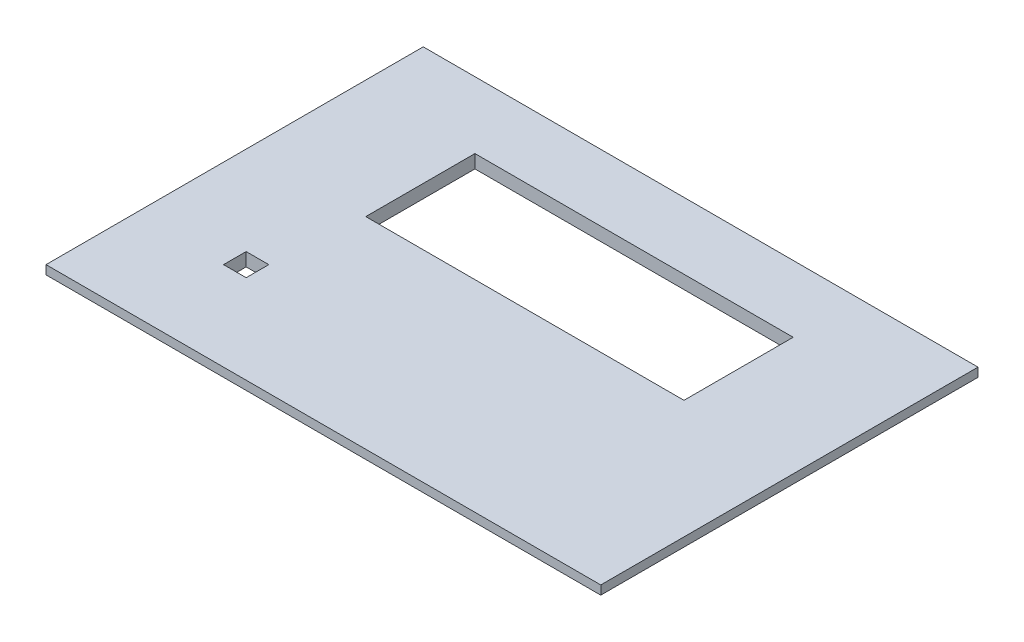
ISO-10303-21;
HEADER;
FILE_DESCRIPTION(('STEP AP214'),'2;1');
FILE_NAME('part.step','',(''),(''),'','','');
FILE_SCHEMA(('AUTOMOTIVE_DESIGN { 1 0 10303 214 1 1 1 1 }'));
ENDSEC;
DATA;
#1=APPLICATION_CONTEXT('core data for automotive mechanical design processes');
#2=APPLICATION_PROTOCOL_DEFINITION('international standard','automotive_design',2000,#1);
#3=PRODUCT_CONTEXT('',#1,'mechanical');
#4=PRODUCT('Part','Part','',(#3));
#5=PRODUCT_RELATED_PRODUCT_CATEGORY('part','',(#4));
#6=PRODUCT_DEFINITION_FORMATION('','',#4);
#7=PRODUCT_DEFINITION_CONTEXT('part definition',#1,'design');
#8=PRODUCT_DEFINITION('design','',#6,#7);
#9=PRODUCT_DEFINITION_SHAPE('','',#8);
#10=(LENGTH_UNIT() NAMED_UNIT(*) SI_UNIT(.MILLI.,.METRE.));
#11=(NAMED_UNIT(*) PLANE_ANGLE_UNIT() SI_UNIT($,.RADIAN.));
#12=(NAMED_UNIT(*) SI_UNIT($,.STERADIAN.) SOLID_ANGLE_UNIT());
#13=UNCERTAINTY_MEASURE_WITH_UNIT(LENGTH_MEASURE(1.E-05),#10,'distance_accuracy_value','');
#14=(GEOMETRIC_REPRESENTATION_CONTEXT(3) GLOBAL_UNCERTAINTY_ASSIGNED_CONTEXT((#13)) GLOBAL_UNIT_ASSIGNED_CONTEXT((#10,
#11,#12)) REPRESENTATION_CONTEXT('',''));
#15=CARTESIAN_POINT('',(0.,0.,0.));
#16=DIRECTION('',(0.,0.,1.));
#17=DIRECTION('',(1.,0.,0.));
#18=AXIS2_PLACEMENT_3D('',#15,#16,#17);
#19=CARTESIAN_POINT('',(57.95,1.,37.95));
#20=DIRECTION('',(-1.,0.,0.));
#21=DIRECTION('',(0.,0.,1.));
#22=AXIS2_PLACEMENT_3D('',#19,#20,#21);
#23=PLANE('',#22);
#24=DIRECTION('',(0.,0.,-1.));
#25=VECTOR('',#24,1.);
#26=CARTESIAN_POINT('',(57.95,0.,37.95));
#27=LINE('',#26,#25);
#28=CARTESIAN_POINT('',(57.95,0.,37.95));
#29=VERTEX_POINT('',#28);
#30=CARTESIAN_POINT('',(57.95,0.,-37.95));
#31=VERTEX_POINT('',#30);
#32=EDGE_CURVE('E251',#29,#31,#27,.T.);
#33=ORIENTED_EDGE('',*,*,#32,.T.);
#34=DIRECTION('',(0.,-1.,0.));
#35=VECTOR('',#34,1.);
#36=CARTESIAN_POINT('',(57.95,1.,-37.95));
#37=LINE('',#36,#35);
#38=CARTESIAN_POINT('',(57.95,1.,-37.95));
#39=VERTEX_POINT('',#38);
#40=EDGE_CURVE('E11',#39,#31,#37,.T.);
#41=ORIENTED_EDGE('',*,*,#40,.F.);
#42=DIRECTION('',(0.,0.,-1.));
#43=VECTOR('',#42,1.);
#44=CARTESIAN_POINT('',(57.95,1.,37.95));
#45=LINE('',#44,#43);
#46=CARTESIAN_POINT('',(57.95,1.,37.95));
#47=VERTEX_POINT('',#46);
#48=EDGE_CURVE('E252',#47,#39,#45,.T.);
#49=ORIENTED_EDGE('',*,*,#48,.F.);
#50=DIRECTION('',(0.,-1.,0.));
#51=VECTOR('',#50,1.);
#52=CARTESIAN_POINT('',(57.95,1.,37.95));
#53=LINE('',#52,#51);
#54=EDGE_CURVE('E265',#47,#29,#53,.T.);
#55=ORIENTED_EDGE('',*,*,#54,.T.);
#56=EDGE_LOOP('',(#33,#41,#49,#55));
#57=FACE_BOUND('',#56,.T.);
#58=ADVANCED_FACE('F39',(#57),#23,.F.);
#59=CARTESIAN_POINT('',(-57.95,1.,-37.95));
#60=DIRECTION('',(0.,0.,1.));
#61=DIRECTION('',(1.,0.,0.));
#62=AXIS2_PLACEMENT_3D('',#59,#60,#61);
#63=PLANE('',#62);
#64=DIRECTION('',(-1.,0.,0.));
#65=VECTOR('',#64,1.);
#66=CARTESIAN_POINT('',(-57.95,0.,-37.95));
#67=LINE('',#66,#65);
#68=CARTESIAN_POINT('',(-57.95,0.,-37.95));
#69=VERTEX_POINT('',#68);
#70=EDGE_CURVE('E268',#31,#69,#67,.T.);
#71=ORIENTED_EDGE('',*,*,#70,.T.);
#72=DIRECTION('',(0.,-1.,0.));
#73=VECTOR('',#72,1.);
#74=CARTESIAN_POINT('',(-57.95,1.,-37.95));
#75=LINE('',#74,#73);
#76=CARTESIAN_POINT('',(-57.95,1.,-37.95));
#77=VERTEX_POINT('',#76);
#78=EDGE_CURVE('E46',#77,#69,#75,.T.);
#79=ORIENTED_EDGE('',*,*,#78,.F.);
#80=DIRECTION('',(-1.,0.,0.));
#81=VECTOR('',#80,1.);
#82=CARTESIAN_POINT('',(-57.95,1.,-37.95));
#83=LINE('',#82,#81);
#84=EDGE_CURVE('E255',#39,#77,#83,.T.);
#85=ORIENTED_EDGE('',*,*,#84,.F.);
#86=ORIENTED_EDGE('',*,*,#40,.T.);
#87=EDGE_LOOP('',(#71,#79,#85,#86));
#88=FACE_BOUND('',#87,.T.);
#89=ADVANCED_FACE('F295',(#88),#63,.F.);
#90=CARTESIAN_POINT('',(-57.95,1.,37.95));
#91=DIRECTION('',(1.,0.,0.));
#92=DIRECTION('',(0.,0.,-1.));
#93=AXIS2_PLACEMENT_3D('',#90,#91,#92);
#94=PLANE('',#93);
#95=DIRECTION('',(0.,0.,1.));
#96=VECTOR('',#95,1.);
#97=CARTESIAN_POINT('',(-57.95,0.,37.95));
#98=LINE('',#97,#96);
#99=CARTESIAN_POINT('',(-57.95,0.,37.95));
#100=VERTEX_POINT('',#99);
#101=EDGE_CURVE('E270',#69,#100,#98,.T.);
#102=ORIENTED_EDGE('',*,*,#101,.T.);
#103=DIRECTION('',(0.,-1.,0.));
#104=VECTOR('',#103,1.);
#105=CARTESIAN_POINT('',(-57.95,1.,37.95));
#106=LINE('',#105,#104);
#107=CARTESIAN_POINT('',(-57.95,1.,37.95));
#108=VERTEX_POINT('',#107);
#109=EDGE_CURVE('E275',#108,#100,#106,.T.);
#110=ORIENTED_EDGE('',*,*,#109,.F.);
#111=DIRECTION('',(0.,0.,1.));
#112=VECTOR('',#111,1.);
#113=CARTESIAN_POINT('',(-57.95,1.,37.95));
#114=LINE('',#113,#112);
#115=EDGE_CURVE('E259',#77,#108,#114,.T.);
#116=ORIENTED_EDGE('',*,*,#115,.F.);
#117=ORIENTED_EDGE('',*,*,#78,.T.);
#118=EDGE_LOOP('',(#102,#110,#116,#117));
#119=FACE_BOUND('',#118,.T.);
#120=ADVANCED_FACE('F281',(#119),#94,.F.);
#121=CARTESIAN_POINT('',(-57.95,1.,37.95));
#122=DIRECTION('',(0.,0.,-1.));
#123=DIRECTION('',(-1.,0.,0.));
#124=AXIS2_PLACEMENT_3D('',#121,#122,#123);
#125=PLANE('',#124);
#126=DIRECTION('',(1.,0.,0.));
#127=VECTOR('',#126,1.);
#128=CARTESIAN_POINT('',(-57.95,0.,37.95));
#129=LINE('',#128,#127);
#130=EDGE_CURVE('E256',#100,#29,#129,.T.);
#131=ORIENTED_EDGE('',*,*,#130,.T.);
#132=ORIENTED_EDGE('',*,*,#54,.F.);
#133=DIRECTION('',(1.,0.,0.));
#134=VECTOR('',#133,1.);
#135=CARTESIAN_POINT('',(-57.95,1.,37.95));
#136=LINE('',#135,#134);
#137=EDGE_CURVE('E262',#108,#47,#136,.T.);
#138=ORIENTED_EDGE('',*,*,#137,.F.);
#139=ORIENTED_EDGE('',*,*,#109,.T.);
#140=EDGE_LOOP('',(#131,#132,#138,#139));
#141=FACE_BOUND('',#140,.T.);
#142=ADVANCED_FACE('F288',(#141),#125,.F.);
#143=CARTESIAN_POINT('',(0.,0.,0.));
#144=DIRECTION('',(0.,-1.,0.));
#145=DIRECTION('',(0.,0.,-1.));
#146=AXIS2_PLACEMENT_3D('',#143,#144,#145);
#147=PLANE('',#146);
#148=DIRECTION('',(0.,0.,-1.));
#149=VECTOR('',#148,1.);
#150=CARTESIAN_POINT('',(35.85,0.,-27.5));
#151=LINE('',#150,#149);
#152=CARTESIAN_POINT('',(35.85,0.,-2.90000000000002));
#153=VERTEX_POINT('',#152);
#154=CARTESIAN_POINT('',(35.85,0.,-27.5));
#155=VERTEX_POINT('',#154);
#156=EDGE_CURVE('E155',#153,#155,#151,.T.);
#157=ORIENTED_EDGE('',*,*,#156,.T.);
#158=DIRECTION('',(-1.,0.,0.));
#159=VECTOR('',#158,1.);
#160=CARTESIAN_POINT('',(-35.85,0.,-27.5));
#161=LINE('',#160,#159);
#162=CARTESIAN_POINT('',(-35.85,0.,-27.5));
#163=VERTEX_POINT('',#162);
#164=EDGE_CURVE('E166',#155,#163,#161,.T.);
#165=ORIENTED_EDGE('',*,*,#164,.T.);
#166=DIRECTION('',(0.,0.,1.));
#167=VECTOR('',#166,1.);
#168=CARTESIAN_POINT('',(-35.85,0.,-27.5));
#169=LINE('',#168,#167);
#170=CARTESIAN_POINT('',(-35.85,0.,-2.90000000000002));
#171=VERTEX_POINT('',#170);
#172=EDGE_CURVE('E53',#163,#171,#169,.T.);
#173=ORIENTED_EDGE('',*,*,#172,.T.);
#174=DIRECTION('',(1.,0.,0.));
#175=VECTOR('',#174,1.);
#176=CARTESIAN_POINT('',(-35.85,0.,-2.90000000000002));
#177=LINE('',#176,#175);
#178=EDGE_CURVE('E163',#171,#153,#177,.T.);
#179=ORIENTED_EDGE('',*,*,#178,.T.);
#180=EDGE_LOOP('',(#157,#165,#173,#179));
#181=FACE_BOUND('',#180,.T.);
#182=DIRECTION('',(0.,0.,-1.));
#183=VECTOR('',#182,1.);
#184=CARTESIAN_POINT('',(-37.4,0.,22.5));
#185=LINE('',#184,#183);
#186=CARTESIAN_POINT('',(-37.4,0.,22.5));
#187=VERTEX_POINT('',#186);
#188=CARTESIAN_POINT('',(-37.4,0.,17.4));
#189=VERTEX_POINT('',#188);
#190=EDGE_CURVE('E207',#187,#189,#185,.T.);
#191=ORIENTED_EDGE('',*,*,#190,.T.);
#192=DIRECTION('',(-1.,0.,0.));
#193=VECTOR('',#192,1.);
#194=CARTESIAN_POINT('',(-42.5,0.,17.4));
#195=LINE('',#194,#193);
#196=CARTESIAN_POINT('',(-42.5,0.,17.4));
#197=VERTEX_POINT('',#196);
#198=EDGE_CURVE('E217',#189,#197,#195,.T.);
#199=ORIENTED_EDGE('',*,*,#198,.T.);
#200=DIRECTION('',(0.,0.,1.));
#201=VECTOR('',#200,1.);
#202=CARTESIAN_POINT('',(-42.5,0.,22.5));
#203=LINE('',#202,#201);
#204=CARTESIAN_POINT('',(-42.5,0.,22.5));
#205=VERTEX_POINT('',#204);
#206=EDGE_CURVE('E61',#197,#205,#203,.T.);
#207=ORIENTED_EDGE('',*,*,#206,.T.);
#208=DIRECTION('',(1.,0.,0.));
#209=VECTOR('',#208,1.);
#210=CARTESIAN_POINT('',(-42.5,0.,22.5));
#211=LINE('',#210,#209);
#212=EDGE_CURVE('E196',#205,#187,#211,.T.);
#213=ORIENTED_EDGE('',*,*,#212,.T.);
#214=EDGE_LOOP('',(#191,#199,#207,#213));
#215=FACE_BOUND('',#214,.T.);
#216=ORIENTED_EDGE('',*,*,#32,.F.);
#217=ORIENTED_EDGE('',*,*,#130,.F.);
#218=ORIENTED_EDGE('',*,*,#101,.F.);
#219=ORIENTED_EDGE('',*,*,#70,.F.);
#220=EDGE_LOOP('',(#216,#217,#218,#219));
#221=FACE_BOUND('',#220,.T.);
#222=ADVANCED_FACE('F170',(#181,#215,#221),#147,.T.);
#223=CARTESIAN_POINT('',(62.5,3.,42.5));
#224=DIRECTION('',(-1.,0.,0.));
#225=DIRECTION('',(0.,0.,1.));
#226=AXIS2_PLACEMENT_3D('',#223,#224,#225);
#227=PLANE('',#226);
#228=DIRECTION('',(0.,0.,-1.));
#229=VECTOR('',#228,1.);
#230=CARTESIAN_POINT('',(62.5,1.,42.5));
#231=LINE('',#230,#229);
#232=CARTESIAN_POINT('',(62.5,1.,42.5));
#233=VERTEX_POINT('',#232);
#234=CARTESIAN_POINT('',(62.5,1.,-42.5));
#235=VERTEX_POINT('',#234);
#236=EDGE_CURVE('E189',#233,#235,#231,.T.);
#237=ORIENTED_EDGE('',*,*,#236,.T.);
#238=DIRECTION('',(0.,-1.,0.));
#239=VECTOR('',#238,1.);
#240=CARTESIAN_POINT('',(62.5,3.,-42.5));
#241=LINE('',#240,#239);
#242=CARTESIAN_POINT('',(62.5,3.,-42.5));
#243=VERTEX_POINT('',#242);
#244=EDGE_CURVE('E248',#243,#235,#241,.T.);
#245=ORIENTED_EDGE('',*,*,#244,.F.);
#246=DIRECTION('',(0.,0.,-1.));
#247=VECTOR('',#246,1.);
#248=CARTESIAN_POINT('',(62.5,3.,42.5));
#249=LINE('',#248,#247);
#250=CARTESIAN_POINT('',(62.5,3.,42.5));
#251=VERTEX_POINT('',#250);
#252=EDGE_CURVE('E222',#251,#243,#249,.T.);
#253=ORIENTED_EDGE('',*,*,#252,.F.);
#254=DIRECTION('',(0.,-1.,0.));
#255=VECTOR('',#254,1.);
#256=CARTESIAN_POINT('',(62.5,3.,42.5));
#257=LINE('',#256,#255);
#258=EDGE_CURVE('E232',#251,#233,#257,.T.);
#259=ORIENTED_EDGE('',*,*,#258,.T.);
#260=EDGE_LOOP('',(#237,#245,#253,#259));
#261=FACE_BOUND('',#260,.T.);
#262=ADVANCED_FACE('F307',(#261),#227,.F.);
#263=CARTESIAN_POINT('',(-62.5,3.,-42.5));
#264=DIRECTION('',(0.,0.,1.));
#265=DIRECTION('',(1.,0.,0.));
#266=AXIS2_PLACEMENT_3D('',#263,#264,#265);
#267=PLANE('',#266);
#268=DIRECTION('',(-1.,0.,0.));
#269=VECTOR('',#268,1.);
#270=CARTESIAN_POINT('',(-62.5,1.,-42.5));
#271=LINE('',#270,#269);
#272=CARTESIAN_POINT('',(-62.5,1.,-42.5));
#273=VERTEX_POINT('',#272);
#274=EDGE_CURVE('E235',#235,#273,#271,.T.);
#275=ORIENTED_EDGE('',*,*,#274,.T.);
#276=DIRECTION('',(0.,-1.,0.));
#277=VECTOR('',#276,1.);
#278=CARTESIAN_POINT('',(-62.5,3.,-42.5));
#279=LINE('',#278,#277);
#280=CARTESIAN_POINT('',(-62.5,3.,-42.5));
#281=VERTEX_POINT('',#280);
#282=EDGE_CURVE('E245',#281,#273,#279,.T.);
#283=ORIENTED_EDGE('',*,*,#282,.F.);
#284=DIRECTION('',(-1.,0.,0.));
#285=VECTOR('',#284,1.);
#286=CARTESIAN_POINT('',(-62.5,3.,-42.5));
#287=LINE('',#286,#285);
#288=EDGE_CURVE('E225',#243,#281,#287,.T.);
#289=ORIENTED_EDGE('',*,*,#288,.F.);
#290=ORIENTED_EDGE('',*,*,#244,.T.);
#291=EDGE_LOOP('',(#275,#283,#289,#290));
#292=FACE_BOUND('',#291,.T.);
#293=ADVANCED_FACE('F310',(#292),#267,.F.);
#294=CARTESIAN_POINT('',(-62.5,3.,42.5));
#295=DIRECTION('',(1.,0.,0.));
#296=DIRECTION('',(0.,0.,-1.));
#297=AXIS2_PLACEMENT_3D('',#294,#295,#296);
#298=PLANE('',#297);
#299=DIRECTION('',(0.,0.,1.));
#300=VECTOR('',#299,1.);
#301=CARTESIAN_POINT('',(-62.5,1.,42.5));
#302=LINE('',#301,#300);
#303=CARTESIAN_POINT('',(-62.5,1.,42.5));
#304=VERTEX_POINT('',#303);
#305=EDGE_CURVE('E237',#273,#304,#302,.T.);
#306=ORIENTED_EDGE('',*,*,#305,.T.);
#307=DIRECTION('',(0.,-1.,0.));
#308=VECTOR('',#307,1.);
#309=CARTESIAN_POINT('',(-62.5,3.,42.5));
#310=LINE('',#309,#308);
#311=CARTESIAN_POINT('',(-62.5,3.,42.5));
#312=VERTEX_POINT('',#311);
#313=EDGE_CURVE('E242',#312,#304,#310,.T.);
#314=ORIENTED_EDGE('',*,*,#313,.F.);
#315=DIRECTION('',(0.,0.,1.));
#316=VECTOR('',#315,1.);
#317=CARTESIAN_POINT('',(-62.5,3.,42.5));
#318=LINE('',#317,#316);
#319=EDGE_CURVE('E228',#281,#312,#318,.T.);
#320=ORIENTED_EDGE('',*,*,#319,.F.);
#321=ORIENTED_EDGE('',*,*,#282,.T.);
#322=EDGE_LOOP('',(#306,#314,#320,#321));
#323=FACE_BOUND('',#322,.T.);
#324=ADVANCED_FACE('F314',(#323),#298,.F.);
#325=CARTESIAN_POINT('',(-62.5,3.,42.5));
#326=DIRECTION('',(0.,0.,-1.));
#327=DIRECTION('',(-1.,0.,0.));
#328=AXIS2_PLACEMENT_3D('',#325,#326,#327);
#329=PLANE('',#328);
#330=DIRECTION('',(1.,0.,0.));
#331=VECTOR('',#330,1.);
#332=CARTESIAN_POINT('',(-62.5,1.,42.5));
#333=LINE('',#332,#331);
#334=EDGE_CURVE('E226',#304,#233,#333,.T.);
#335=ORIENTED_EDGE('',*,*,#334,.T.);
#336=ORIENTED_EDGE('',*,*,#258,.F.);
#337=DIRECTION('',(1.,0.,0.));
#338=VECTOR('',#337,1.);
#339=CARTESIAN_POINT('',(-62.5,3.,42.5));
#340=LINE('',#339,#338);
#341=EDGE_CURVE('E230',#312,#251,#340,.T.);
#342=ORIENTED_EDGE('',*,*,#341,.F.);
#343=ORIENTED_EDGE('',*,*,#313,.T.);
#344=EDGE_LOOP('',(#335,#336,#342,#343));
#345=FACE_BOUND('',#344,.T.);
#346=ADVANCED_FACE('F318',(#345),#329,.F.);
#347=CARTESIAN_POINT('',(0.,3.,0.));
#348=DIRECTION('',(0.,-1.,0.));
#349=DIRECTION('',(0.,0.,-1.));
#350=AXIS2_PLACEMENT_3D('',#347,#348,#349);
#351=PLANE('',#350);
#352=DIRECTION('',(-1.,0.,0.));
#353=VECTOR('',#352,1.);
#354=CARTESIAN_POINT('',(-35.85,3.,-27.5));
#355=LINE('',#354,#353);
#356=CARTESIAN_POINT('',(35.85,3.,-27.5));
#357=VERTEX_POINT('',#356);
#358=CARTESIAN_POINT('',(-35.85,3.,-27.5));
#359=VERTEX_POINT('',#358);
#360=EDGE_CURVE('E182',#357,#359,#355,.T.);
#361=ORIENTED_EDGE('',*,*,#360,.F.);
#362=DIRECTION('',(0.,0.,-1.));
#363=VECTOR('',#362,1.);
#364=CARTESIAN_POINT('',(35.85,3.,-27.5));
#365=LINE('',#364,#363);
#366=CARTESIAN_POINT('',(35.85,3.,-2.90000000000002));
#367=VERTEX_POINT('',#366);
#368=EDGE_CURVE('E158',#367,#357,#365,.T.);
#369=ORIENTED_EDGE('',*,*,#368,.F.);
#370=DIRECTION('',(1.,0.,0.));
#371=VECTOR('',#370,1.);
#372=CARTESIAN_POINT('',(-35.85,3.,-2.90000000000002));
#373=LINE('',#372,#371);
#374=CARTESIAN_POINT('',(-35.85,3.,-2.90000000000002));
#375=VERTEX_POINT('',#374);
#376=EDGE_CURVE('E173',#375,#367,#373,.T.);
#377=ORIENTED_EDGE('',*,*,#376,.F.);
#378=DIRECTION('',(0.,0.,1.));
#379=VECTOR('',#378,1.);
#380=CARTESIAN_POINT('',(-35.85,3.,-27.5));
#381=LINE('',#380,#379);
#382=EDGE_CURVE('E176',#359,#375,#381,.T.);
#383=ORIENTED_EDGE('',*,*,#382,.F.);
#384=EDGE_LOOP('',(#361,#369,#377,#383));
#385=FACE_BOUND('',#384,.T.);
#386=DIRECTION('',(-1.,0.,0.));
#387=VECTOR('',#386,1.);
#388=CARTESIAN_POINT('',(-42.5,3.,17.4));
#389=LINE('',#388,#387);
#390=CARTESIAN_POINT('',(-37.4,3.,17.4));
#391=VERTEX_POINT('',#390);
#392=CARTESIAN_POINT('',(-42.5,3.,17.4));
#393=VERTEX_POINT('',#392);
#394=EDGE_CURVE('E210',#391,#393,#389,.T.);
#395=ORIENTED_EDGE('',*,*,#394,.F.);
#396=DIRECTION('',(0.,0.,-1.));
#397=VECTOR('',#396,1.);
#398=CARTESIAN_POINT('',(-37.4,3.,22.5));
#399=LINE('',#398,#397);
#400=CARTESIAN_POINT('',(-37.4,3.,22.5));
#401=VERTEX_POINT('',#400);
#402=EDGE_CURVE('E183',#401,#391,#399,.T.);
#403=ORIENTED_EDGE('',*,*,#402,.F.);
#404=DIRECTION('',(1.,0.,0.));
#405=VECTOR('',#404,1.);
#406=CARTESIAN_POINT('',(-42.5,3.,22.5));
#407=LINE('',#406,#405);
#408=CARTESIAN_POINT('',(-42.5,3.,22.5));
#409=VERTEX_POINT('',#408);
#410=EDGE_CURVE('E203',#409,#401,#407,.T.);
#411=ORIENTED_EDGE('',*,*,#410,.F.);
#412=DIRECTION('',(0.,0.,1.));
#413=VECTOR('',#412,1.);
#414=CARTESIAN_POINT('',(-42.5,3.,22.5));
#415=LINE('',#414,#413);
#416=EDGE_CURVE('E206',#393,#409,#415,.T.);
#417=ORIENTED_EDGE('',*,*,#416,.F.);
#418=EDGE_LOOP('',(#395,#403,#411,#417));
#419=FACE_BOUND('',#418,.T.);
#420=ORIENTED_EDGE('',*,*,#252,.T.);
#421=ORIENTED_EDGE('',*,*,#288,.T.);
#422=ORIENTED_EDGE('',*,*,#319,.T.);
#423=ORIENTED_EDGE('',*,*,#341,.T.);
#424=EDGE_LOOP('',(#420,#421,#422,#423));
#425=FACE_BOUND('',#424,.T.);
#426=ADVANCED_FACE('F322',(#385,#419,#425),#351,.F.);
#427=CARTESIAN_POINT('',(0.,1.,0.));
#428=DIRECTION('',(0.,-1.,0.));
#429=DIRECTION('',(0.,0.,-1.));
#430=AXIS2_PLACEMENT_3D('',#427,#428,#429);
#431=PLANE('',#430);
#432=ORIENTED_EDGE('',*,*,#137,.T.);
#433=ORIENTED_EDGE('',*,*,#48,.T.);
#434=ORIENTED_EDGE('',*,*,#84,.T.);
#435=ORIENTED_EDGE('',*,*,#115,.T.);
#436=EDGE_LOOP('',(#432,#433,#434,#435));
#437=FACE_BOUND('',#436,.T.);
#438=ORIENTED_EDGE('',*,*,#236,.F.);
#439=ORIENTED_EDGE('',*,*,#334,.F.);
#440=ORIENTED_EDGE('',*,*,#305,.F.);
#441=ORIENTED_EDGE('',*,*,#274,.F.);
#442=EDGE_LOOP('',(#438,#439,#440,#441));
#443=FACE_BOUND('',#442,.T.);
#444=ADVANCED_FACE('F293',(#437,#443),#431,.T.);
#445=CARTESIAN_POINT('',(-37.4,0.,22.5));
#446=DIRECTION('',(1.,0.,0.));
#447=DIRECTION('',(0.,0.,-1.));
#448=AXIS2_PLACEMENT_3D('',#445,#446,#447);
#449=PLANE('',#448);
#450=ORIENTED_EDGE('',*,*,#402,.T.);
#451=DIRECTION('',(0.,1.,0.));
#452=VECTOR('',#451,1.);
#453=CARTESIAN_POINT('',(-37.4,0.,17.4));
#454=LINE('',#453,#452);
#455=EDGE_CURVE('E193',#189,#391,#454,.T.);
#456=ORIENTED_EDGE('',*,*,#455,.F.);
#457=ORIENTED_EDGE('',*,*,#190,.F.);
#458=DIRECTION('',(0.,1.,0.));
#459=VECTOR('',#458,1.);
#460=CARTESIAN_POINT('',(-37.4,0.,22.5));
#461=LINE('',#460,#459);
#462=EDGE_CURVE('E201',#187,#401,#461,.T.);
#463=ORIENTED_EDGE('',*,*,#462,.T.);
#464=EDGE_LOOP('',(#450,#456,#457,#463));
#465=FACE_BOUND('',#464,.T.);
#466=ADVANCED_FACE('F326',(#465),#449,.F.);
#467=CARTESIAN_POINT('',(-42.5,0.,22.5));
#468=DIRECTION('',(0.,0.,1.));
#469=DIRECTION('',(1.,0.,0.));
#470=AXIS2_PLACEMENT_3D('',#467,#468,#469);
#471=PLANE('',#470);
#472=ORIENTED_EDGE('',*,*,#410,.T.);
#473=ORIENTED_EDGE('',*,*,#462,.F.);
#474=ORIENTED_EDGE('',*,*,#212,.F.);
#475=DIRECTION('',(0.,1.,0.));
#476=VECTOR('',#475,1.);
#477=CARTESIAN_POINT('',(-42.5,0.,22.5));
#478=LINE('',#477,#476);
#479=EDGE_CURVE('E199',#205,#409,#478,.T.);
#480=ORIENTED_EDGE('',*,*,#479,.T.);
#481=EDGE_LOOP('',(#472,#473,#474,#480));
#482=FACE_BOUND('',#481,.T.);
#483=ADVANCED_FACE('F330',(#482),#471,.F.);
#484=CARTESIAN_POINT('',(-42.5,0.,22.5));
#485=DIRECTION('',(-1.,0.,0.));
#486=DIRECTION('',(0.,0.,1.));
#487=AXIS2_PLACEMENT_3D('',#484,#485,#486);
#488=PLANE('',#487);
#489=ORIENTED_EDGE('',*,*,#416,.T.);
#490=ORIENTED_EDGE('',*,*,#479,.F.);
#491=ORIENTED_EDGE('',*,*,#206,.F.);
#492=DIRECTION('',(0.,1.,0.));
#493=VECTOR('',#492,1.);
#494=CARTESIAN_POINT('',(-42.5,0.,17.4));
#495=LINE('',#494,#493);
#496=EDGE_CURVE('E197',#197,#393,#495,.T.);
#497=ORIENTED_EDGE('',*,*,#496,.T.);
#498=EDGE_LOOP('',(#489,#490,#491,#497));
#499=FACE_BOUND('',#498,.T.);
#500=ADVANCED_FACE('F333',(#499),#488,.F.);
#501=CARTESIAN_POINT('',(-42.5,0.,17.4));
#502=DIRECTION('',(0.,0.,-1.));
#503=DIRECTION('',(-1.,0.,0.));
#504=AXIS2_PLACEMENT_3D('',#501,#502,#503);
#505=PLANE('',#504);
#506=ORIENTED_EDGE('',*,*,#394,.T.);
#507=ORIENTED_EDGE('',*,*,#496,.F.);
#508=ORIENTED_EDGE('',*,*,#198,.F.);
#509=ORIENTED_EDGE('',*,*,#455,.T.);
#510=EDGE_LOOP('',(#506,#507,#508,#509));
#511=FACE_BOUND('',#510,.T.);
#512=ADVANCED_FACE('F337',(#511),#505,.F.);
#513=CARTESIAN_POINT('',(35.85,0.,-27.5));
#514=DIRECTION('',(1.,0.,0.));
#515=DIRECTION('',(0.,0.,-1.));
#516=AXIS2_PLACEMENT_3D('',#513,#514,#515);
#517=PLANE('',#516);
#518=ORIENTED_EDGE('',*,*,#368,.T.);
#519=DIRECTION('',(0.,1.,0.));
#520=VECTOR('',#519,1.);
#521=CARTESIAN_POINT('',(35.85,0.,-27.5));
#522=LINE('',#521,#520);
#523=EDGE_CURVE('E151',#155,#357,#522,.T.);
#524=ORIENTED_EDGE('',*,*,#523,.F.);
#525=ORIENTED_EDGE('',*,*,#156,.F.);
#526=DIRECTION('',(0.,1.,0.));
#527=VECTOR('',#526,1.);
#528=CARTESIAN_POINT('',(35.85,0.,-2.90000000000002));
#529=LINE('',#528,#527);
#530=EDGE_CURVE('E187',#153,#367,#529,.T.);
#531=ORIENTED_EDGE('',*,*,#530,.T.);
#532=EDGE_LOOP('',(#518,#524,#525,#531));
#533=FACE_BOUND('',#532,.T.);
#534=ADVANCED_FACE('F153',(#533),#517,.F.);
#535=CARTESIAN_POINT('',(-35.85,0.,-2.90000000000002));
#536=DIRECTION('',(0.,0.,1.));
#537=DIRECTION('',(1.,0.,0.));
#538=AXIS2_PLACEMENT_3D('',#535,#536,#537);
#539=PLANE('',#538);
#540=ORIENTED_EDGE('',*,*,#376,.T.);
#541=ORIENTED_EDGE('',*,*,#530,.F.);
#542=ORIENTED_EDGE('',*,*,#178,.F.);
#543=DIRECTION('',(0.,1.,0.));
#544=VECTOR('',#543,1.);
#545=CARTESIAN_POINT('',(-35.85,0.,-2.90000000000002));
#546=LINE('',#545,#544);
#547=EDGE_CURVE('E190',#171,#375,#546,.T.);
#548=ORIENTED_EDGE('',*,*,#547,.T.);
#549=EDGE_LOOP('',(#540,#541,#542,#548));
#550=FACE_BOUND('',#549,.T.);
#551=ADVANCED_FACE('F346',(#550),#539,.F.);
#552=CARTESIAN_POINT('',(-35.85,0.,-27.5));
#553=DIRECTION('',(-1.,0.,0.));
#554=DIRECTION('',(0.,0.,1.));
#555=AXIS2_PLACEMENT_3D('',#552,#553,#554);
#556=PLANE('',#555);
#557=ORIENTED_EDGE('',*,*,#382,.T.);
#558=ORIENTED_EDGE('',*,*,#547,.F.);
#559=ORIENTED_EDGE('',*,*,#172,.F.);
#560=DIRECTION('',(0.,1.,0.));
#561=VECTOR('',#560,1.);
#562=CARTESIAN_POINT('',(-35.85,0.,-27.5));
#563=LINE('',#562,#561);
#564=EDGE_CURVE('E162',#163,#359,#563,.T.);
#565=ORIENTED_EDGE('',*,*,#564,.T.);
#566=EDGE_LOOP('',(#557,#558,#559,#565));
#567=FACE_BOUND('',#566,.T.);
#568=ADVANCED_FACE('F349',(#567),#556,.F.);
#569=CARTESIAN_POINT('',(-35.85,0.,-27.5));
#570=DIRECTION('',(0.,0.,-1.));
#571=DIRECTION('',(-1.,0.,0.));
#572=AXIS2_PLACEMENT_3D('',#569,#570,#571);
#573=PLANE('',#572);
#574=ORIENTED_EDGE('',*,*,#360,.T.);
#575=ORIENTED_EDGE('',*,*,#564,.F.);
#576=ORIENTED_EDGE('',*,*,#164,.F.);
#577=ORIENTED_EDGE('',*,*,#523,.T.);
#578=EDGE_LOOP('',(#574,#575,#576,#577));
#579=FACE_BOUND('',#578,.T.);
#580=ADVANCED_FACE('F167',(#579),#573,.F.);
#581=CLOSED_SHELL('',(#58,#89,#120,#142,#222,#262,#293,#324,#346,#426,#444,#466,#483,#500,#512,
#534,#551,#568,#580));
#582=MANIFOLD_SOLID_BREP('B2',#581);
#583=ADVANCED_BREP_SHAPE_REPRESENTATION('',(#18,#582),#14);
#584=SHAPE_DEFINITION_REPRESENTATION(#9,#583);
ENDSEC;
END-ISO-10303-21;
